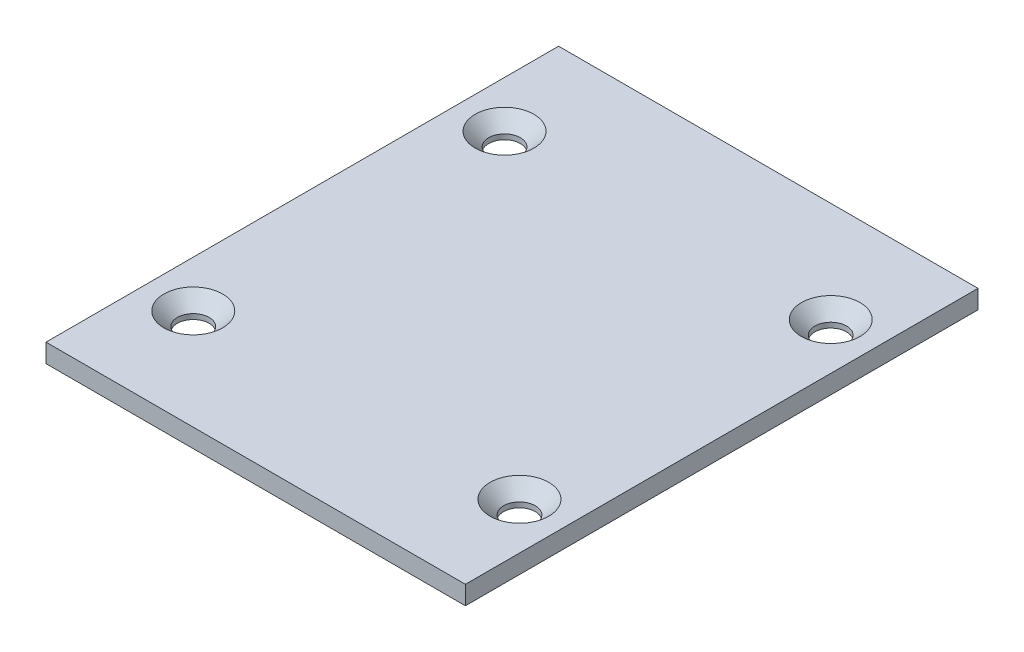
ISO-10303-21;
HEADER;
FILE_DESCRIPTION(('STEP AP214'),'2;1');
FILE_NAME('part.step','',(''),(''),'','','');
FILE_SCHEMA(('AUTOMOTIVE_DESIGN { 1 0 10303 214 1 1 1 1 }'));
ENDSEC;
DATA;
#1=APPLICATION_CONTEXT('core data for automotive mechanical design processes');
#2=APPLICATION_PROTOCOL_DEFINITION('international standard','automotive_design',2000,#1);
#3=PRODUCT_CONTEXT('',#1,'mechanical');
#4=PRODUCT('Part','Part','',(#3));
#5=PRODUCT_RELATED_PRODUCT_CATEGORY('part','',(#4));
#6=PRODUCT_DEFINITION_FORMATION('','',#4);
#7=PRODUCT_DEFINITION_CONTEXT('part definition',#1,'design');
#8=PRODUCT_DEFINITION('design','',#6,#7);
#9=PRODUCT_DEFINITION_SHAPE('','',#8);
#10=(LENGTH_UNIT() NAMED_UNIT(*) SI_UNIT(.MILLI.,.METRE.));
#11=(NAMED_UNIT(*) PLANE_ANGLE_UNIT() SI_UNIT($,.RADIAN.));
#12=(NAMED_UNIT(*) SI_UNIT($,.STERADIAN.) SOLID_ANGLE_UNIT());
#13=UNCERTAINTY_MEASURE_WITH_UNIT(LENGTH_MEASURE(1.E-05),#10,'distance_accuracy_value','');
#14=(GEOMETRIC_REPRESENTATION_CONTEXT(3) GLOBAL_UNCERTAINTY_ASSIGNED_CONTEXT((#13)) GLOBAL_UNIT_ASSIGNED_CONTEXT((#10,
#11,#12)) REPRESENTATION_CONTEXT('',''));
#15=CARTESIAN_POINT('',(0.,0.,0.));
#16=DIRECTION('',(0.,0.,1.));
#17=DIRECTION('',(1.,0.,0.));
#18=AXIS2_PLACEMENT_3D('',#15,#16,#17);
#19=CARTESIAN_POINT('',(0.,2.,27.5));
#20=DIRECTION('',(0.,0.,-1.));
#21=DIRECTION('',(-1.,0.,0.));
#22=AXIS2_PLACEMENT_3D('',#19,#20,#21);
#23=PLANE('',#22);
#24=DIRECTION('',(1.,0.,0.));
#25=VECTOR('',#24,1.);
#26=CARTESIAN_POINT('',(0.,0.,27.5));
#27=LINE('',#26,#25);
#28=CARTESIAN_POINT('',(-22.5,0.,27.5));
#29=VERTEX_POINT('',#28);
#30=CARTESIAN_POINT('',(22.5,0.,27.5));
#31=VERTEX_POINT('',#30);
#32=EDGE_CURVE('E113',#29,#31,#27,.T.);
#33=ORIENTED_EDGE('',*,*,#32,.T.);
#34=DIRECTION('',(0.,-1.,0.));
#35=VECTOR('',#34,1.);
#36=CARTESIAN_POINT('',(22.5,2.,27.5));
#37=LINE('',#36,#35);
#38=CARTESIAN_POINT('',(22.5,2.,27.5));
#39=VERTEX_POINT('',#38);
#40=EDGE_CURVE('E11',#39,#31,#37,.T.);
#41=ORIENTED_EDGE('',*,*,#40,.F.);
#42=DIRECTION('',(1.,0.,0.));
#43=VECTOR('',#42,1.);
#44=CARTESIAN_POINT('',(0.,2.,27.5));
#45=LINE('',#44,#43);
#46=CARTESIAN_POINT('',(-22.5,2.,27.5));
#47=VERTEX_POINT('',#46);
#48=EDGE_CURVE('E95',#47,#39,#45,.T.);
#49=ORIENTED_EDGE('',*,*,#48,.F.);
#50=DIRECTION('',(0.,-1.,0.));
#51=VECTOR('',#50,1.);
#52=CARTESIAN_POINT('',(-22.5,2.,27.5));
#53=LINE('',#52,#51);
#54=EDGE_CURVE('E62',#47,#29,#53,.T.);
#55=ORIENTED_EDGE('',*,*,#54,.T.);
#56=EDGE_LOOP('',(#33,#41,#49,#55));
#57=FACE_BOUND('',#56,.T.);
#58=ADVANCED_FACE('F45',(#57),#23,.F.);
#59=CARTESIAN_POINT('',(22.5,2.,0.));
#60=DIRECTION('',(-1.,0.,0.));
#61=DIRECTION('',(0.,0.,1.));
#62=AXIS2_PLACEMENT_3D('',#59,#60,#61);
#63=PLANE('',#62);
#64=DIRECTION('',(0.,0.,-1.));
#65=VECTOR('',#64,1.);
#66=CARTESIAN_POINT('',(22.5,0.,0.));
#67=LINE('',#66,#65);
#68=CARTESIAN_POINT('',(22.5,0.,-27.5));
#69=VERTEX_POINT('',#68);
#70=EDGE_CURVE('E101',#31,#69,#67,.T.);
#71=ORIENTED_EDGE('',*,*,#70,.T.);
#72=DIRECTION('',(0.,-1.,0.));
#73=VECTOR('',#72,1.);
#74=CARTESIAN_POINT('',(22.5,2.,-27.5));
#75=LINE('',#74,#73);
#76=CARTESIAN_POINT('',(22.5,2.,-27.5));
#77=VERTEX_POINT('',#76);
#78=EDGE_CURVE('E54',#77,#69,#75,.T.);
#79=ORIENTED_EDGE('',*,*,#78,.F.);
#80=DIRECTION('',(0.,0.,-1.));
#81=VECTOR('',#80,1.);
#82=CARTESIAN_POINT('',(22.5,2.,0.));
#83=LINE('',#82,#81);
#84=EDGE_CURVE('E87',#39,#77,#83,.T.);
#85=ORIENTED_EDGE('',*,*,#84,.F.);
#86=ORIENTED_EDGE('',*,*,#40,.T.);
#87=EDGE_LOOP('',(#71,#79,#85,#86));
#88=FACE_BOUND('',#87,.T.);
#89=ADVANCED_FACE('F100',(#88),#63,.F.);
#90=CARTESIAN_POINT('',(0.,2.,-27.5));
#91=DIRECTION('',(0.,0.,-1.));
#92=DIRECTION('',(-1.,0.,0.));
#93=AXIS2_PLACEMENT_3D('',#90,#91,#92);
#94=PLANE('',#93);
#95=DIRECTION('',(1.,0.,0.));
#96=VECTOR('',#95,1.);
#97=CARTESIAN_POINT('',(0.,0.,-27.5));
#98=LINE('',#97,#96);
#99=CARTESIAN_POINT('',(-22.5,0.,-27.5));
#100=VERTEX_POINT('',#99);
#101=EDGE_CURVE('E119',#100,#69,#98,.T.);
#102=ORIENTED_EDGE('',*,*,#101,.F.);
#103=DIRECTION('',(0.,-1.,0.));
#104=VECTOR('',#103,1.);
#105=CARTESIAN_POINT('',(-22.5,2.,-27.5));
#106=LINE('',#105,#104);
#107=CARTESIAN_POINT('',(-22.5,2.,-27.5));
#108=VERTEX_POINT('',#107);
#109=EDGE_CURVE('E76',#108,#100,#106,.T.);
#110=ORIENTED_EDGE('',*,*,#109,.F.);
#111=DIRECTION('',(1.,0.,0.));
#112=VECTOR('',#111,1.);
#113=CARTESIAN_POINT('',(0.,2.,-27.5));
#114=LINE('',#113,#112);
#115=EDGE_CURVE('E94',#108,#77,#114,.T.);
#116=ORIENTED_EDGE('',*,*,#115,.T.);
#117=ORIENTED_EDGE('',*,*,#78,.T.);
#118=EDGE_LOOP('',(#102,#110,#116,#117));
#119=FACE_BOUND('',#118,.T.);
#120=ADVANCED_FACE('F105',(#119),#94,.T.);
#121=CARTESIAN_POINT('',(-22.5,2.,0.));
#122=DIRECTION('',(-1.,0.,0.));
#123=DIRECTION('',(0.,0.,1.));
#124=AXIS2_PLACEMENT_3D('',#121,#122,#123);
#125=PLANE('',#124);
#126=DIRECTION('',(0.,0.,-1.));
#127=VECTOR('',#126,1.);
#128=CARTESIAN_POINT('',(-22.5,0.,0.));
#129=LINE('',#128,#127);
#130=EDGE_CURVE('E122',#29,#100,#129,.T.);
#131=ORIENTED_EDGE('',*,*,#130,.F.);
#132=ORIENTED_EDGE('',*,*,#54,.F.);
#133=DIRECTION('',(0.,0.,-1.));
#134=VECTOR('',#133,1.);
#135=CARTESIAN_POINT('',(-22.5,2.,0.));
#136=LINE('',#135,#134);
#137=EDGE_CURVE('E107',#47,#108,#136,.T.);
#138=ORIENTED_EDGE('',*,*,#137,.T.);
#139=ORIENTED_EDGE('',*,*,#109,.T.);
#140=EDGE_LOOP('',(#131,#132,#138,#139));
#141=FACE_BOUND('',#140,.T.);
#142=ADVANCED_FACE('F185',(#141),#125,.T.);
#143=CARTESIAN_POINT('',(0.,2.,0.));
#144=DIRECTION('',(0.,1.,0.));
#145=DIRECTION('',(0.,0.,1.));
#146=AXIS2_PLACEMENT_3D('',#143,#144,#145);
#147=PLANE('',#146);
#148=CARTESIAN_POINT('',(-17.5,2.,-16.7));
#149=DIRECTION('',(0.,1.,0.));
#150=DIRECTION('',(0.,0.,1.));
#151=AXIS2_PLACEMENT_3D('',#148,#149,#150);
#152=CIRCLE('',#151,3.15);
#153=CARTESIAN_POINT('',(-17.5,2.,-13.55));
#154=VERTEX_POINT('',#153);
#155=EDGE_CURVE('E175',#154,#154,#152,.T.);
#156=ORIENTED_EDGE('',*,*,#155,.F.);
#157=EDGE_LOOP('',(#156));
#158=FACE_BOUND('',#157,.T.);
#159=CARTESIAN_POINT('',(17.5,2.,-16.7));
#160=DIRECTION('',(0.,1.,0.));
#161=DIRECTION('',(0.,0.,1.));
#162=AXIS2_PLACEMENT_3D('',#159,#160,#161);
#163=CIRCLE('',#162,3.15);
#164=CARTESIAN_POINT('',(17.5,2.,-13.55));
#165=VERTEX_POINT('',#164);
#166=EDGE_CURVE('E163',#165,#165,#163,.T.);
#167=ORIENTED_EDGE('',*,*,#166,.F.);
#168=EDGE_LOOP('',(#167));
#169=FACE_BOUND('',#168,.T.);
#170=CARTESIAN_POINT('',(17.5,2.,16.7));
#171=DIRECTION('',(0.,1.,0.));
#172=DIRECTION('',(0.,0.,1.));
#173=AXIS2_PLACEMENT_3D('',#170,#171,#172);
#174=CIRCLE('',#173,3.15);
#175=CARTESIAN_POINT('',(17.5,2.,19.85));
#176=VERTEX_POINT('',#175);
#177=EDGE_CURVE('E151',#176,#176,#174,.T.);
#178=ORIENTED_EDGE('',*,*,#177,.F.);
#179=EDGE_LOOP('',(#178));
#180=FACE_BOUND('',#179,.T.);
#181=CARTESIAN_POINT('',(-17.5,2.,16.7));
#182=DIRECTION('',(0.,1.,0.));
#183=DIRECTION('',(0.,0.,1.));
#184=AXIS2_PLACEMENT_3D('',#181,#182,#183);
#185=CIRCLE('',#184,3.15);
#186=CARTESIAN_POINT('',(-17.5,2.,19.85));
#187=VERTEX_POINT('',#186);
#188=EDGE_CURVE('E139',#187,#187,#185,.T.);
#189=ORIENTED_EDGE('',*,*,#188,.F.);
#190=EDGE_LOOP('',(#189));
#191=FACE_BOUND('',#190,.T.);
#192=ORIENTED_EDGE('',*,*,#48,.T.);
#193=ORIENTED_EDGE('',*,*,#84,.T.);
#194=ORIENTED_EDGE('',*,*,#115,.F.);
#195=ORIENTED_EDGE('',*,*,#137,.F.);
#196=EDGE_LOOP('',(#192,#193,#194,#195));
#197=FACE_BOUND('',#196,.T.);
#198=ADVANCED_FACE('F91',(#158,#169,#180,#191,#197),#147,.T.);
#199=CARTESIAN_POINT('',(0.,0.,0.));
#200=DIRECTION('',(0.,1.,0.));
#201=DIRECTION('',(0.,0.,1.));
#202=AXIS2_PLACEMENT_3D('',#199,#200,#201);
#203=PLANE('',#202);
#204=CARTESIAN_POINT('',(-17.5,0.,-16.7));
#205=DIRECTION('',(0.,1.,0.));
#206=DIRECTION('',(0.,0.,1.));
#207=AXIS2_PLACEMENT_3D('',#204,#205,#206);
#208=CIRCLE('',#207,1.7);
#209=CARTESIAN_POINT('',(-17.5,0.,-15.));
#210=VERTEX_POINT('',#209);
#211=EDGE_CURVE('E167',#210,#210,#208,.T.);
#212=ORIENTED_EDGE('',*,*,#211,.T.);
#213=EDGE_LOOP('',(#212));
#214=FACE_BOUND('',#213,.T.);
#215=CARTESIAN_POINT('',(17.5,0.,-16.7));
#216=DIRECTION('',(0.,1.,0.));
#217=DIRECTION('',(0.,0.,1.));
#218=AXIS2_PLACEMENT_3D('',#215,#216,#217);
#219=CIRCLE('',#218,1.7);
#220=CARTESIAN_POINT('',(17.5,0.,-15.));
#221=VERTEX_POINT('',#220);
#222=EDGE_CURVE('E155',#221,#221,#219,.T.);
#223=ORIENTED_EDGE('',*,*,#222,.T.);
#224=EDGE_LOOP('',(#223));
#225=FACE_BOUND('',#224,.T.);
#226=CARTESIAN_POINT('',(17.5,0.,16.7));
#227=DIRECTION('',(0.,1.,0.));
#228=DIRECTION('',(0.,0.,1.));
#229=AXIS2_PLACEMENT_3D('',#226,#227,#228);
#230=CIRCLE('',#229,1.7);
#231=CARTESIAN_POINT('',(17.5,0.,18.4));
#232=VERTEX_POINT('',#231);
#233=EDGE_CURVE('E143',#232,#232,#230,.T.);
#234=ORIENTED_EDGE('',*,*,#233,.T.);
#235=EDGE_LOOP('',(#234));
#236=FACE_BOUND('',#235,.T.);
#237=CARTESIAN_POINT('',(-17.5,0.,16.7));
#238=DIRECTION('',(0.,1.,0.));
#239=DIRECTION('',(0.,0.,1.));
#240=AXIS2_PLACEMENT_3D('',#237,#238,#239);
#241=CIRCLE('',#240,1.7);
#242=CARTESIAN_POINT('',(-17.5,0.,18.4));
#243=VERTEX_POINT('',#242);
#244=EDGE_CURVE('E116',#243,#243,#241,.T.);
#245=ORIENTED_EDGE('',*,*,#244,.T.);
#246=EDGE_LOOP('',(#245));
#247=FACE_BOUND('',#246,.T.);
#248=ORIENTED_EDGE('',*,*,#32,.F.);
#249=ORIENTED_EDGE('',*,*,#130,.T.);
#250=ORIENTED_EDGE('',*,*,#101,.T.);
#251=ORIENTED_EDGE('',*,*,#70,.F.);
#252=EDGE_LOOP('',(#248,#249,#250,#251));
#253=FACE_BOUND('',#252,.T.);
#254=ADVANCED_FACE('F184',(#214,#225,#236,#247,#253),#203,.F.);
#255=CARTESIAN_POINT('',(-17.5,2.,16.7));
#256=DIRECTION('',(0.,1.,0.));
#257=DIRECTION('',(0.,0.,1.));
#258=AXIS2_PLACEMENT_3D('',#255,#256,#257);
#259=CYLINDRICAL_SURFACE('',#258,1.7);
#260=ORIENTED_EDGE('',*,*,#244,.F.);
#261=EDGE_LOOP('',(#260));
#262=FACE_BOUND('',#261,.T.);
#263=CARTESIAN_POINT('',(-17.5,0.55,16.7));
#264=DIRECTION('',(0.,1.,0.));
#265=DIRECTION('',(0.,0.,1.));
#266=AXIS2_PLACEMENT_3D('',#263,#264,#265);
#267=CIRCLE('',#266,1.7);
#268=CARTESIAN_POINT('',(-17.5,0.55,18.4));
#269=VERTEX_POINT('',#268);
#270=EDGE_CURVE('E135',#269,#269,#267,.T.);
#271=ORIENTED_EDGE('',*,*,#270,.T.);
#272=EDGE_LOOP('',(#271));
#273=FACE_BOUND('',#272,.T.);
#274=ADVANCED_FACE('F196',(#262,#273),#259,.F.);
#275=CARTESIAN_POINT('',(-17.5,2.,16.7));
#276=DIRECTION('',(0.,1.,0.));
#277=DIRECTION('',(0.,0.,1.));
#278=AXIS2_PLACEMENT_3D('',#275,#276,#277);
#279=CONICAL_SURFACE('',#278,3.15,0.785398163397448);
#280=ORIENTED_EDGE('',*,*,#270,.F.);
#281=EDGE_LOOP('',(#280));
#282=FACE_BOUND('',#281,.T.);
#283=ORIENTED_EDGE('',*,*,#188,.T.);
#284=EDGE_LOOP('',(#283));
#285=FACE_BOUND('',#284,.T.);
#286=ADVANCED_FACE('F193',(#282,#285),#279,.F.);
#287=CARTESIAN_POINT('',(17.5,2.,16.7));
#288=DIRECTION('',(0.,1.,0.));
#289=DIRECTION('',(0.,0.,1.));
#290=AXIS2_PLACEMENT_3D('',#287,#288,#289);
#291=CYLINDRICAL_SURFACE('',#290,1.7);
#292=ORIENTED_EDGE('',*,*,#233,.F.);
#293=EDGE_LOOP('',(#292));
#294=FACE_BOUND('',#293,.T.);
#295=CARTESIAN_POINT('',(17.5,0.55,16.7));
#296=DIRECTION('',(0.,1.,0.));
#297=DIRECTION('',(0.,0.,1.));
#298=AXIS2_PLACEMENT_3D('',#295,#296,#297);
#299=CIRCLE('',#298,1.7);
#300=CARTESIAN_POINT('',(17.5,0.55,18.4));
#301=VERTEX_POINT('',#300);
#302=EDGE_CURVE('E147',#301,#301,#299,.T.);
#303=ORIENTED_EDGE('',*,*,#302,.T.);
#304=EDGE_LOOP('',(#303));
#305=FACE_BOUND('',#304,.T.);
#306=ADVANCED_FACE('F195',(#294,#305),#291,.F.);
#307=CARTESIAN_POINT('',(17.5,2.,16.7));
#308=DIRECTION('',(0.,1.,0.));
#309=DIRECTION('',(0.,0.,1.));
#310=AXIS2_PLACEMENT_3D('',#307,#308,#309);
#311=CONICAL_SURFACE('',#310,3.15,0.785398163397448);
#312=ORIENTED_EDGE('',*,*,#302,.F.);
#313=EDGE_LOOP('',(#312));
#314=FACE_BOUND('',#313,.T.);
#315=ORIENTED_EDGE('',*,*,#177,.T.);
#316=EDGE_LOOP('',(#315));
#317=FACE_BOUND('',#316,.T.);
#318=ADVANCED_FACE('F203',(#314,#317),#311,.F.);
#319=CARTESIAN_POINT('',(17.5,2.,-16.7));
#320=DIRECTION('',(0.,1.,0.));
#321=DIRECTION('',(0.,0.,1.));
#322=AXIS2_PLACEMENT_3D('',#319,#320,#321);
#323=CYLINDRICAL_SURFACE('',#322,1.7);
#324=ORIENTED_EDGE('',*,*,#222,.F.);
#325=EDGE_LOOP('',(#324));
#326=FACE_BOUND('',#325,.T.);
#327=CARTESIAN_POINT('',(17.5,0.55,-16.7));
#328=DIRECTION('',(0.,1.,0.));
#329=DIRECTION('',(0.,0.,1.));
#330=AXIS2_PLACEMENT_3D('',#327,#328,#329);
#331=CIRCLE('',#330,1.7);
#332=CARTESIAN_POINT('',(17.5,0.55,-15.));
#333=VERTEX_POINT('',#332);
#334=EDGE_CURVE('E159',#333,#333,#331,.T.);
#335=ORIENTED_EDGE('',*,*,#334,.T.);
#336=EDGE_LOOP('',(#335));
#337=FACE_BOUND('',#336,.T.);
#338=ADVANCED_FACE('F237',(#326,#337),#323,.F.);
#339=CARTESIAN_POINT('',(17.5,2.,-16.7));
#340=DIRECTION('',(0.,1.,0.));
#341=DIRECTION('',(0.,0.,1.));
#342=AXIS2_PLACEMENT_3D('',#339,#340,#341);
#343=CONICAL_SURFACE('',#342,3.15,0.785398163397448);
#344=ORIENTED_EDGE('',*,*,#334,.F.);
#345=EDGE_LOOP('',(#344));
#346=FACE_BOUND('',#345,.T.);
#347=ORIENTED_EDGE('',*,*,#166,.T.);
#348=EDGE_LOOP('',(#347));
#349=FACE_BOUND('',#348,.T.);
#350=ADVANCED_FACE('F242',(#346,#349),#343,.F.);
#351=CARTESIAN_POINT('',(-17.5,2.,-16.7));
#352=DIRECTION('',(0.,1.,0.));
#353=DIRECTION('',(0.,0.,1.));
#354=AXIS2_PLACEMENT_3D('',#351,#352,#353);
#355=CYLINDRICAL_SURFACE('',#354,1.7);
#356=ORIENTED_EDGE('',*,*,#211,.F.);
#357=EDGE_LOOP('',(#356));
#358=FACE_BOUND('',#357,.T.);
#359=CARTESIAN_POINT('',(-17.5,0.55,-16.7));
#360=DIRECTION('',(0.,1.,0.));
#361=DIRECTION('',(0.,0.,1.));
#362=AXIS2_PLACEMENT_3D('',#359,#360,#361);
#363=CIRCLE('',#362,1.7);
#364=CARTESIAN_POINT('',(-17.5,0.55,-15.));
#365=VERTEX_POINT('',#364);
#366=EDGE_CURVE('E171',#365,#365,#363,.T.);
#367=ORIENTED_EDGE('',*,*,#366,.T.);
#368=EDGE_LOOP('',(#367));
#369=FACE_BOUND('',#368,.T.);
#370=ADVANCED_FACE('F248',(#358,#369),#355,.F.);
#371=CARTESIAN_POINT('',(-17.5,2.,-16.7));
#372=DIRECTION('',(0.,1.,0.));
#373=DIRECTION('',(0.,0.,1.));
#374=AXIS2_PLACEMENT_3D('',#371,#372,#373);
#375=CONICAL_SURFACE('',#374,3.15,0.785398163397448);
#376=ORIENTED_EDGE('',*,*,#366,.F.);
#377=EDGE_LOOP('',(#376));
#378=FACE_BOUND('',#377,.T.);
#379=ORIENTED_EDGE('',*,*,#155,.T.);
#380=EDGE_LOOP('',(#379));
#381=FACE_BOUND('',#380,.T.);
#382=ADVANCED_FACE('F180',(#378,#381),#375,.F.);
#383=CLOSED_SHELL('',(#58,#89,#120,#142,#198,#254,#274,#286,#306,#318,#338,#350,#370,#382));
#384=MANIFOLD_SOLID_BREP('B2',#383);
#385=ADVANCED_BREP_SHAPE_REPRESENTATION('',(#18,#384),#14);
#386=SHAPE_DEFINITION_REPRESENTATION(#9,#385);
ENDSEC;
END-ISO-10303-21;
